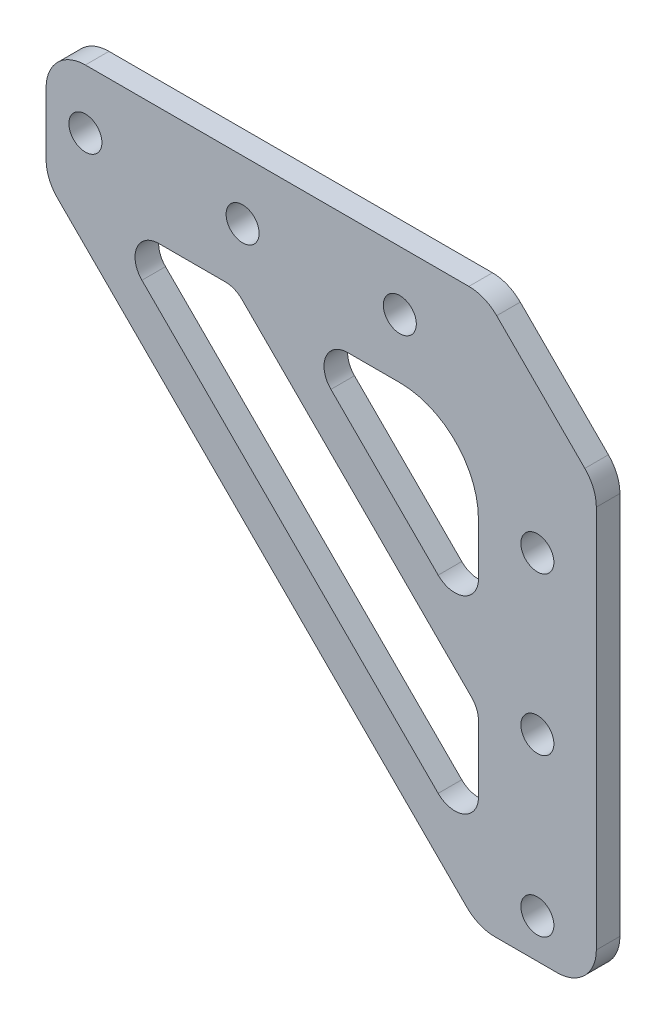
ISO-10303-21;
HEADER;
FILE_DESCRIPTION(('STEP AP214'),'2;1');
FILE_NAME('part.step','',(''),(''),'','','');
FILE_SCHEMA(('AUTOMOTIVE_DESIGN { 1 0 10303 214 1 1 1 1 }'));
ENDSEC;
DATA;
#1=APPLICATION_CONTEXT('core data for automotive mechanical design processes');
#2=APPLICATION_PROTOCOL_DEFINITION('international standard','automotive_design',2000,#1);
#3=PRODUCT_CONTEXT('',#1,'mechanical');
#4=PRODUCT('Part','Part','',(#3));
#5=PRODUCT_RELATED_PRODUCT_CATEGORY('part','',(#4));
#6=PRODUCT_DEFINITION_FORMATION('','',#4);
#7=PRODUCT_DEFINITION_CONTEXT('part definition',#1,'design');
#8=PRODUCT_DEFINITION('design','',#6,#7);
#9=PRODUCT_DEFINITION_SHAPE('','',#8);
#10=(LENGTH_UNIT() NAMED_UNIT(*) SI_UNIT(.MILLI.,.METRE.));
#11=(NAMED_UNIT(*) PLANE_ANGLE_UNIT() SI_UNIT($,.RADIAN.));
#12=(NAMED_UNIT(*) SI_UNIT($,.STERADIAN.) SOLID_ANGLE_UNIT());
#13=UNCERTAINTY_MEASURE_WITH_UNIT(LENGTH_MEASURE(1.E-05),#10,'distance_accuracy_value','');
#14=(GEOMETRIC_REPRESENTATION_CONTEXT(3) GLOBAL_UNCERTAINTY_ASSIGNED_CONTEXT((#13)) GLOBAL_UNIT_ASSIGNED_CONTEXT((#10,
#11,#12)) REPRESENTATION_CONTEXT('',''));
#15=CARTESIAN_POINT('',(0.,0.,0.));
#16=DIRECTION('',(0.,0.,1.));
#17=DIRECTION('',(1.,0.,0.));
#18=AXIS2_PLACEMENT_3D('',#15,#16,#17);
#19=CARTESIAN_POINT('',(-70.,-15.,3.));
#20=DIRECTION('',(0.,1.,0.));
#21=DIRECTION('',(0.,0.,1.));
#22=AXIS2_PLACEMENT_3D('',#19,#20,#21);
#23=PLANE('',#22);
#24=DIRECTION('',(1.,0.,0.));
#25=VECTOR('',#24,1.);
#26=CARTESIAN_POINT('',(-70.,-15.,0.));
#27=LINE('',#26,#25);
#28=CARTESIAN_POINT('',(-31.6446609406726,-15.,0.));
#29=VERTEX_POINT('',#28);
#30=CARTESIAN_POINT('',(-25.,-15.,0.));
#31=VERTEX_POINT('',#30);
#32=EDGE_CURVE('E459',#29,#31,#27,.T.);
#33=ORIENTED_EDGE('',*,*,#32,.T.);
#34=DIRECTION('',(0.,0.,-1.));
#35=VECTOR('',#34,1.);
#36=CARTESIAN_POINT('',(-25.,-15.,3.));
#37=LINE('',#36,#35);
#38=CARTESIAN_POINT('',(-25.,-15.,3.));
#39=VERTEX_POINT('',#38);
#40=EDGE_CURVE('E62',#31,#39,#37,.F.);
#41=ORIENTED_EDGE('',*,*,#40,.T.);
#42=DIRECTION('',(1.,0.,0.));
#43=VECTOR('',#42,1.);
#44=CARTESIAN_POINT('',(-70.,-15.,3.));
#45=LINE('',#44,#43);
#46=CARTESIAN_POINT('',(-31.6446609406726,-15.,3.));
#47=VERTEX_POINT('',#46);
#48=EDGE_CURVE('E446',#47,#39,#45,.T.);
#49=ORIENTED_EDGE('',*,*,#48,.F.);
#50=DIRECTION('',(0.,0.,1.));
#51=VECTOR('',#50,1.);
#52=CARTESIAN_POINT('',(-31.6446609406726,-15.,3.));
#53=LINE('',#52,#51);
#54=EDGE_CURVE('E317',#47,#29,#53,.F.);
#55=ORIENTED_EDGE('',*,*,#54,.T.);
#56=EDGE_LOOP('',(#33,#41,#49,#55));
#57=FACE_BOUND('',#56,.T.);
#58=ADVANCED_FACE('F41',(#57),#23,.F.);
#59=CARTESIAN_POINT('',(-15.,-70.,3.));
#60=DIRECTION('',(1.,0.,0.));
#61=DIRECTION('',(0.,1.,0.));
#62=AXIS2_PLACEMENT_3D('',#59,#60,#61);
#63=PLANE('',#62);
#64=DIRECTION('',(0.,-1.,0.));
#65=VECTOR('',#64,1.);
#66=CARTESIAN_POINT('',(-15.,-70.,3.));
#67=LINE('',#66,#65);
#68=CARTESIAN_POINT('',(-15.,-25.,3.));
#69=VERTEX_POINT('',#68);
#70=CARTESIAN_POINT('',(-15.,-31.6446609406726,3.));
#71=VERTEX_POINT('',#70);
#72=EDGE_CURVE('E356',#69,#71,#67,.T.);
#73=ORIENTED_EDGE('',*,*,#72,.F.);
#74=DIRECTION('',(0.,0.,-1.));
#75=VECTOR('',#74,1.);
#76=CARTESIAN_POINT('',(-15.,-25.,0.));
#77=LINE('',#76,#75);
#78=CARTESIAN_POINT('',(-15.,-25.,0.));
#79=VERTEX_POINT('',#78);
#80=EDGE_CURVE('E349',#69,#79,#77,.T.);
#81=ORIENTED_EDGE('',*,*,#80,.T.);
#82=DIRECTION('',(0.,-1.,0.));
#83=VECTOR('',#82,1.);
#84=CARTESIAN_POINT('',(-15.,-70.,0.));
#85=LINE('',#84,#83);
#86=CARTESIAN_POINT('',(-15.,-31.6446609406726,0.));
#87=VERTEX_POINT('',#86);
#88=EDGE_CURVE('E241',#79,#87,#85,.T.);
#89=ORIENTED_EDGE('',*,*,#88,.T.);
#90=DIRECTION('',(0.,0.,1.));
#91=VECTOR('',#90,1.);
#92=CARTESIAN_POINT('',(-15.,-31.6446609406726,3.));
#93=LINE('',#92,#91);
#94=EDGE_CURVE('E309',#87,#71,#93,.T.);
#95=ORIENTED_EDGE('',*,*,#94,.T.);
#96=EDGE_LOOP('',(#73,#81,#89,#95));
#97=FACE_BOUND('',#96,.T.);
#98=ADVANCED_FACE('F355',(#97),#63,.F.);
#99=CARTESIAN_POINT('',(0.,0.,3.));
#100=DIRECTION('',(-1.,0.,0.));
#101=DIRECTION('',(0.,-1.,0.));
#102=AXIS2_PLACEMENT_3D('',#99,#100,#101);
#103=PLANE('',#102);
#104=DIRECTION('',(0.,1.,0.));
#105=VECTOR('',#104,1.);
#106=CARTESIAN_POINT('',(0.,0.,3.));
#107=LINE('',#106,#105);
#108=CARTESIAN_POINT('',(0.,-65.,3.));
#109=VERTEX_POINT('',#108);
#110=CARTESIAN_POINT('',(0.,-16.2132034355964,3.));
#111=VERTEX_POINT('',#110);
#112=EDGE_CURVE('E240',#109,#111,#107,.T.);
#113=ORIENTED_EDGE('',*,*,#112,.F.);
#114=DIRECTION('',(0.,0.,-1.));
#115=VECTOR('',#114,1.);
#116=CARTESIAN_POINT('',(0.,-65.,3.));
#117=LINE('',#116,#115);
#118=CARTESIAN_POINT('',(0.,-65.,0.));
#119=VERTEX_POINT('',#118);
#120=EDGE_CURVE('E276',#109,#119,#117,.T.);
#121=ORIENTED_EDGE('',*,*,#120,.T.);
#122=DIRECTION('',(0.,1.,0.));
#123=VECTOR('',#122,1.);
#124=CARTESIAN_POINT('',(0.,0.,0.));
#125=LINE('',#124,#123);
#126=CARTESIAN_POINT('',(0.,-16.2132034355964,0.));
#127=VERTEX_POINT('',#126);
#128=EDGE_CURVE('E438',#119,#127,#125,.T.);
#129=ORIENTED_EDGE('',*,*,#128,.T.);
#130=DIRECTION('',(0.,0.,-1.));
#131=VECTOR('',#130,1.);
#132=CARTESIAN_POINT('',(0.,-16.2132034355964,3.));
#133=LINE('',#132,#131);
#134=EDGE_CURVE('E274',#127,#111,#133,.F.);
#135=ORIENTED_EDGE('',*,*,#134,.T.);
#136=EDGE_LOOP('',(#113,#121,#129,#135));
#137=FACE_BOUND('',#136,.T.);
#138=ADVANCED_FACE('F514',(#137),#103,.F.);
#139=CARTESIAN_POINT('',(0.,0.,3.));
#140=DIRECTION('',(0.,0.,-1.));
#141=DIRECTION('',(-1.,0.,0.));
#142=AXIS2_PLACEMENT_3D('',#139,#140,#141);
#143=PLANE('',#142);
#144=DIRECTION('',(-0.707106781186548,0.707106781186547,0.));
#145=VECTOR('',#144,1.);
#146=CARTESIAN_POINT('',(-15.,-62.9289321881345,3.));
#147=LINE('',#146,#145);
#148=CARTESIAN_POINT('',(-20.1213203435596,-57.8076118445749,3.));
#149=VERTEX_POINT('',#148);
#150=CARTESIAN_POINT('',(-57.8076118445749,-20.1213203435596,3.));
#151=VERTEX_POINT('',#150);
#152=EDGE_CURVE('E397',#149,#151,#147,.T.);
#153=ORIENTED_EDGE('',*,*,#152,.T.);
#154=CARTESIAN_POINT('',(-55.6862915010152,-18.,3.));
#155=DIRECTION('',(0.,0.,-1.));
#156=DIRECTION('',(-1.,0.,0.));
#157=AXIS2_PLACEMENT_3D('',#154,#155,#156);
#158=CIRCLE('',#157,3.);
#159=CARTESIAN_POINT('',(-55.6862915010152,-15.,3.));
#160=VERTEX_POINT('',#159);
#161=EDGE_CURVE('E345',#151,#160,#158,.T.);
#162=ORIENTED_EDGE('',*,*,#161,.T.);
#163=CARTESIAN_POINT('',(-47.2010101267766,-15.,3.));
#164=VERTEX_POINT('',#163);
#165=EDGE_CURVE('E448',#160,#164,#45,.T.);
#166=ORIENTED_EDGE('',*,*,#165,.T.);
#167=CARTESIAN_POINT('',(-47.2010101267766,-18.,3.));
#168=DIRECTION('',(0.,0.,-1.));
#169=DIRECTION('',(-1.,0.,0.));
#170=AXIS2_PLACEMENT_3D('',#167,#168,#169);
#171=CIRCLE('',#170,3.);
#172=CARTESIAN_POINT('',(-45.079689783217,-15.8786796564404,3.));
#173=VERTEX_POINT('',#172);
#174=EDGE_CURVE('E328',#164,#173,#171,.T.);
#175=ORIENTED_EDGE('',*,*,#174,.T.);
#176=DIRECTION('',(0.707106781186547,-0.707106781186547,0.));
#177=VECTOR('',#176,1.);
#178=CARTESIAN_POINT('',(-45.9583694396574,-15.,3.));
#179=LINE('',#178,#177);
#180=CARTESIAN_POINT('',(-15.8786796564404,-45.079689783217,3.));
#181=VERTEX_POINT('',#180);
#182=EDGE_CURVE('E379',#173,#181,#179,.T.);
#183=ORIENTED_EDGE('',*,*,#182,.T.);
#184=CARTESIAN_POINT('',(-18.,-47.2010101267767,3.));
#185=DIRECTION('',(0.,0.,-1.));
#186=DIRECTION('',(-1.,0.,0.));
#187=AXIS2_PLACEMENT_3D('',#184,#185,#186);
#188=CIRCLE('',#187,3.);
#189=CARTESIAN_POINT('',(-15.,-47.2010101267767,3.));
#190=VERTEX_POINT('',#189);
#191=EDGE_CURVE('E324',#181,#190,#188,.T.);
#192=ORIENTED_EDGE('',*,*,#191,.T.);
#193=CARTESIAN_POINT('',(-15.,-55.6862915010152,3.));
#194=VERTEX_POINT('',#193);
#195=EDGE_CURVE('E450',#190,#194,#67,.T.);
#196=ORIENTED_EDGE('',*,*,#195,.T.);
#197=CARTESIAN_POINT('',(-18.,-55.6862915010152,3.));
#198=DIRECTION('',(0.,0.,-1.));
#199=DIRECTION('',(-1.,0.,0.));
#200=AXIS2_PLACEMENT_3D('',#197,#198,#199);
#201=CIRCLE('',#200,3.);
#202=EDGE_CURVE('E341',#194,#149,#201,.T.);
#203=ORIENTED_EDGE('',*,*,#202,.T.);
#204=EDGE_LOOP('',(#153,#162,#166,#175,#183,#192,#196,#203));
#205=FACE_BOUND('',#204,.T.);
#206=ORIENTED_EDGE('',*,*,#48,.T.);
#207=CARTESIAN_POINT('',(-25.,-25.,3.));
#208=DIRECTION('',(0.,0.,-1.));
#209=DIRECTION('',(-1.,0.,0.));
#210=AXIS2_PLACEMENT_3D('',#207,#208,#209);
#211=CIRCLE('',#210,10.);
#212=EDGE_CURVE('E11',#39,#69,#211,.T.);
#213=ORIENTED_EDGE('',*,*,#212,.T.);
#214=ORIENTED_EDGE('',*,*,#72,.T.);
#215=CARTESIAN_POINT('',(-18.,-31.6446609406726,3.));
#216=DIRECTION('',(0.,0.,-1.));
#217=DIRECTION('',(-1.,0.,0.));
#218=AXIS2_PLACEMENT_3D('',#215,#216,#217);
#219=CIRCLE('',#218,3.);
#220=CARTESIAN_POINT('',(-20.1213203435596,-33.7659812842323,3.));
#221=VERTEX_POINT('',#220);
#222=EDGE_CURVE('E332',#71,#221,#219,.T.);
#223=ORIENTED_EDGE('',*,*,#222,.T.);
#224=DIRECTION('',(-0.707106781186548,0.707106781186547,0.));
#225=VECTOR('',#224,1.);
#226=CARTESIAN_POINT('',(-15.,-38.8873016277919,3.));
#227=LINE('',#226,#225);
#228=CARTESIAN_POINT('',(-33.7659812842323,-20.1213203435596,3.));
#229=VERTEX_POINT('',#228);
#230=EDGE_CURVE('E374',#221,#229,#227,.T.);
#231=ORIENTED_EDGE('',*,*,#230,.T.);
#232=CARTESIAN_POINT('',(-31.6446609406726,-18.,3.));
#233=DIRECTION('',(0.,0.,-1.));
#234=DIRECTION('',(-1.,0.,0.));
#235=AXIS2_PLACEMENT_3D('',#232,#233,#234);
#236=CIRCLE('',#235,3.);
#237=EDGE_CURVE('E337',#229,#47,#236,.T.);
#238=ORIENTED_EDGE('',*,*,#237,.T.);
#239=EDGE_LOOP('',(#206,#213,#214,#223,#231,#238));
#240=FACE_BOUND('',#239,.T.);
#241=DIRECTION('',(0.707106781186548,-0.707106781186548,0.));
#242=VECTOR('',#241,1.);
#243=CARTESIAN_POINT('',(-70.,-15.,3.));
#244=LINE('',#243,#242);
#245=CARTESIAN_POINT('',(-68.5355339059327,-16.4644660940673,3.));
#246=VERTEX_POINT('',#245);
#247=CARTESIAN_POINT('',(-16.4644660940673,-68.5355339059327,3.));
#248=VERTEX_POINT('',#247);
#249=EDGE_CURVE('E390',#246,#248,#244,.T.);
#250=ORIENTED_EDGE('',*,*,#249,.T.);
#251=CARTESIAN_POINT('',(-12.9289321881345,-65.,3.));
#252=DIRECTION('',(0.,0.,-1.));
#253=DIRECTION('',(-1.,0.,0.));
#254=AXIS2_PLACEMENT_3D('',#251,#252,#253);
#255=CIRCLE('',#254,5.);
#256=CARTESIAN_POINT('',(-12.9289321881345,-70.,3.));
#257=VERTEX_POINT('',#256);
#258=EDGE_CURVE('E272',#248,#257,#255,.F.);
#259=ORIENTED_EDGE('',*,*,#258,.T.);
#260=DIRECTION('',(1.,0.,0.));
#261=VECTOR('',#260,1.);
#262=CARTESIAN_POINT('',(0.,-70.,3.));
#263=LINE('',#262,#261);
#264=CARTESIAN_POINT('',(-4.99999999999996,-70.,3.));
#265=VERTEX_POINT('',#264);
#266=EDGE_CURVE('E234',#257,#265,#263,.T.);
#267=ORIENTED_EDGE('',*,*,#266,.T.);
#268=CARTESIAN_POINT('',(-4.99999999999996,-65.,3.));
#269=DIRECTION('',(0.,0.,-1.));
#270=DIRECTION('',(-1.,0.,0.));
#271=AXIS2_PLACEMENT_3D('',#268,#269,#270);
#272=CIRCLE('',#271,5.);
#273=EDGE_CURVE('E270',#265,#109,#272,.F.);
#274=ORIENTED_EDGE('',*,*,#273,.T.);
#275=ORIENTED_EDGE('',*,*,#112,.T.);
#276=CARTESIAN_POINT('',(-4.99999999999999,-16.2132034355964,3.));
#277=DIRECTION('',(0.,0.,-1.));
#278=DIRECTION('',(-1.,0.,0.));
#279=AXIS2_PLACEMENT_3D('',#276,#277,#278);
#280=CIRCLE('',#279,5.);
#281=CARTESIAN_POINT('',(-1.46446609406726,-12.6776695296637,3.));
#282=VERTEX_POINT('',#281);
#283=EDGE_CURVE('E264',#111,#282,#280,.F.);
#284=ORIENTED_EDGE('',*,*,#283,.T.);
#285=DIRECTION('',(-0.707106781186548,0.707106781186547,0.));
#286=VECTOR('',#285,1.);
#287=CARTESIAN_POINT('',(-14.142135623731,0.,3.));
#288=LINE('',#287,#286);
#289=CARTESIAN_POINT('',(-12.6776695296637,-1.46446609406725,3.));
#290=VERTEX_POINT('',#289);
#291=EDGE_CURVE('E391',#282,#290,#288,.T.);
#292=ORIENTED_EDGE('',*,*,#291,.T.);
#293=CARTESIAN_POINT('',(-16.2132034355964,-4.99999999999999,3.));
#294=DIRECTION('',(0.,0.,-1.));
#295=DIRECTION('',(-1.,0.,0.));
#296=AXIS2_PLACEMENT_3D('',#293,#294,#295);
#297=CIRCLE('',#296,5.);
#298=CARTESIAN_POINT('',(-16.2132034355964,0.,3.));
#299=VERTEX_POINT('',#298);
#300=EDGE_CURVE('E262',#290,#299,#297,.F.);
#301=ORIENTED_EDGE('',*,*,#300,.T.);
#302=DIRECTION('',(-1.,0.,0.));
#303=VECTOR('',#302,1.);
#304=CARTESIAN_POINT('',(0.,0.,3.));
#305=LINE('',#304,#303);
#306=CARTESIAN_POINT('',(-65.,0.,3.));
#307=VERTEX_POINT('',#306);
#308=EDGE_CURVE('E244',#299,#307,#305,.T.);
#309=ORIENTED_EDGE('',*,*,#308,.T.);
#310=CARTESIAN_POINT('',(-65.,-4.99999999999997,3.));
#311=DIRECTION('',(0.,0.,-1.));
#312=DIRECTION('',(-1.,0.,0.));
#313=AXIS2_PLACEMENT_3D('',#310,#311,#312);
#314=CIRCLE('',#313,5.);
#315=CARTESIAN_POINT('',(-70.,-4.99999999999996,3.));
#316=VERTEX_POINT('',#315);
#317=EDGE_CURVE('E266',#307,#316,#314,.F.);
#318=ORIENTED_EDGE('',*,*,#317,.T.);
#319=DIRECTION('',(0.,-1.,0.));
#320=VECTOR('',#319,1.);
#321=CARTESIAN_POINT('',(-70.,0.,3.));
#322=LINE('',#321,#320);
#323=CARTESIAN_POINT('',(-70.,-12.9289321881345,3.));
#324=VERTEX_POINT('',#323);
#325=EDGE_CURVE('E443',#316,#324,#322,.T.);
#326=ORIENTED_EDGE('',*,*,#325,.T.);
#327=CARTESIAN_POINT('',(-65.,-12.9289321881345,3.));
#328=DIRECTION('',(0.,0.,-1.));
#329=DIRECTION('',(-1.,0.,0.));
#330=AXIS2_PLACEMENT_3D('',#327,#328,#329);
#331=CIRCLE('',#330,5.);
#332=EDGE_CURVE('E268',#324,#246,#331,.F.);
#333=ORIENTED_EDGE('',*,*,#332,.T.);
#334=EDGE_LOOP('',(#250,#259,#267,#274,#275,#284,#292,#301,#309,#318,#326,#333));
#335=FACE_BOUND('',#334,.T.);
#336=CARTESIAN_POINT('',(-45.,-7.5,3.));
#337=DIRECTION('',(0.,0.,1.));
#338=DIRECTION('',(1.,0.,0.));
#339=AXIS2_PLACEMENT_3D('',#336,#337,#338);
#340=CIRCLE('',#339,2.1);
#341=CARTESIAN_POINT('',(-42.9,-7.5,3.));
#342=VERTEX_POINT('',#341);
#343=EDGE_CURVE('E435',#342,#342,#340,.T.);
#344=ORIENTED_EDGE('',*,*,#343,.F.);
#345=EDGE_LOOP('',(#344));
#346=FACE_BOUND('',#345,.T.);
#347=CARTESIAN_POINT('',(-25.,-7.5,3.));
#348=DIRECTION('',(0.,0.,1.));
#349=DIRECTION('',(1.,0.,0.));
#350=AXIS2_PLACEMENT_3D('',#347,#348,#349);
#351=CIRCLE('',#350,2.1);
#352=CARTESIAN_POINT('',(-22.9,-7.5,3.));
#353=VERTEX_POINT('',#352);
#354=EDGE_CURVE('E429',#353,#353,#351,.T.);
#355=ORIENTED_EDGE('',*,*,#354,.F.);
#356=EDGE_LOOP('',(#355));
#357=FACE_BOUND('',#356,.T.);
#358=CARTESIAN_POINT('',(-7.49999999999999,-25.,3.));
#359=DIRECTION('',(0.,0.,1.));
#360=DIRECTION('',(-1.,0.,0.));
#361=AXIS2_PLACEMENT_3D('',#358,#359,#360);
#362=CIRCLE('',#361,2.1);
#363=CARTESIAN_POINT('',(-9.59999999999999,-25.,3.));
#364=VERTEX_POINT('',#363);
#365=EDGE_CURVE('E423',#364,#364,#362,.T.);
#366=ORIENTED_EDGE('',*,*,#365,.F.);
#367=EDGE_LOOP('',(#366));
#368=FACE_BOUND('',#367,.T.);
#369=CARTESIAN_POINT('',(-7.49999999999999,-65.,3.));
#370=DIRECTION('',(0.,0.,1.));
#371=DIRECTION('',(-1.,0.,0.));
#372=AXIS2_PLACEMENT_3D('',#369,#370,#371);
#373=CIRCLE('',#372,2.10000000000002);
#374=CARTESIAN_POINT('',(-9.60000000000001,-65.,3.));
#375=VERTEX_POINT('',#374);
#376=EDGE_CURVE('E417',#375,#375,#373,.T.);
#377=ORIENTED_EDGE('',*,*,#376,.F.);
#378=EDGE_LOOP('',(#377));
#379=FACE_BOUND('',#378,.T.);
#380=CARTESIAN_POINT('',(-65.,-7.5,3.));
#381=DIRECTION('',(0.,0.,1.));
#382=DIRECTION('',(1.,0.,0.));
#383=AXIS2_PLACEMENT_3D('',#380,#381,#382);
#384=CIRCLE('',#383,2.1);
#385=CARTESIAN_POINT('',(-62.9,-7.5,3.));
#386=VERTEX_POINT('',#385);
#387=EDGE_CURVE('E411',#386,#386,#384,.T.);
#388=ORIENTED_EDGE('',*,*,#387,.F.);
#389=EDGE_LOOP('',(#388));
#390=FACE_BOUND('',#389,.T.);
#391=CARTESIAN_POINT('',(-7.49999999999999,-45.,3.));
#392=DIRECTION('',(0.,0.,1.));
#393=DIRECTION('',(-1.,0.,0.));
#394=AXIS2_PLACEMENT_3D('',#391,#392,#393);
#395=CIRCLE('',#394,2.10000000000001);
#396=CARTESIAN_POINT('',(-9.6,-45.,3.));
#397=VERTEX_POINT('',#396);
#398=EDGE_CURVE('E405',#397,#397,#395,.T.);
#399=ORIENTED_EDGE('',*,*,#398,.F.);
#400=EDGE_LOOP('',(#399));
#401=FACE_BOUND('',#400,.T.);
#402=ADVANCED_FACE('F372',(#205,#240,#335,#346,#357,#368,#379,#390,#401),#143,.F.);
#403=CARTESIAN_POINT('',(0.,0.,0.));
#404=DIRECTION('',(0.,0.,-1.));
#405=DIRECTION('',(-1.,0.,0.));
#406=AXIS2_PLACEMENT_3D('',#403,#404,#405);
#407=PLANE('',#406);
#408=DIRECTION('',(0.707106781186547,-0.707106781186547,0.));
#409=VECTOR('',#408,1.);
#410=CARTESIAN_POINT('',(-45.9583694396574,-15.,0.));
#411=LINE('',#410,#409);
#412=CARTESIAN_POINT('',(-45.079689783217,-15.8786796564404,0.));
#413=VERTEX_POINT('',#412);
#414=CARTESIAN_POINT('',(-15.8786796564404,-45.079689783217,0.));
#415=VERTEX_POINT('',#414);
#416=EDGE_CURVE('E378',#413,#415,#411,.T.);
#417=ORIENTED_EDGE('',*,*,#416,.F.);
#418=CARTESIAN_POINT('',(-47.2010101267766,-18.,0.));
#419=DIRECTION('',(0.,0.,-1.));
#420=DIRECTION('',(-1.,0.,0.));
#421=AXIS2_PLACEMENT_3D('',#418,#419,#420);
#422=CIRCLE('',#421,3.);
#423=CARTESIAN_POINT('',(-47.2010101267766,-15.,0.));
#424=VERTEX_POINT('',#423);
#425=EDGE_CURVE('E330',#413,#424,#422,.F.);
#426=ORIENTED_EDGE('',*,*,#425,.T.);
#427=CARTESIAN_POINT('',(-55.6862915010152,-15.,0.));
#428=VERTEX_POINT('',#427);
#429=EDGE_CURVE('E460',#428,#424,#27,.T.);
#430=ORIENTED_EDGE('',*,*,#429,.F.);
#431=CARTESIAN_POINT('',(-55.6862915010152,-18.,0.));
#432=DIRECTION('',(0.,0.,-1.));
#433=DIRECTION('',(-1.,0.,0.));
#434=AXIS2_PLACEMENT_3D('',#431,#432,#433);
#435=CIRCLE('',#434,3.);
#436=CARTESIAN_POINT('',(-57.8076118445749,-20.1213203435596,0.));
#437=VERTEX_POINT('',#436);
#438=EDGE_CURVE('E347',#428,#437,#435,.F.);
#439=ORIENTED_EDGE('',*,*,#438,.T.);
#440=DIRECTION('',(-0.707106781186548,0.707106781186547,0.));
#441=VECTOR('',#440,1.);
#442=CARTESIAN_POINT('',(-15.,-62.9289321881345,0.));
#443=LINE('',#442,#441);
#444=CARTESIAN_POINT('',(-20.1213203435596,-57.8076118445749,0.));
#445=VERTEX_POINT('',#444);
#446=EDGE_CURVE('E396',#445,#437,#443,.T.);
#447=ORIENTED_EDGE('',*,*,#446,.F.);
#448=CARTESIAN_POINT('',(-18.,-55.6862915010152,0.));
#449=DIRECTION('',(0.,0.,-1.));
#450=DIRECTION('',(-1.,0.,0.));
#451=AXIS2_PLACEMENT_3D('',#448,#449,#450);
#452=CIRCLE('',#451,3.);
#453=CARTESIAN_POINT('',(-15.,-55.6862915010152,0.));
#454=VERTEX_POINT('',#453);
#455=EDGE_CURVE('E343',#445,#454,#452,.F.);
#456=ORIENTED_EDGE('',*,*,#455,.T.);
#457=CARTESIAN_POINT('',(-15.,-47.2010101267767,0.));
#458=VERTEX_POINT('',#457);
#459=EDGE_CURVE('E246',#458,#454,#85,.T.);
#460=ORIENTED_EDGE('',*,*,#459,.F.);
#461=CARTESIAN_POINT('',(-18.,-47.2010101267767,0.));
#462=DIRECTION('',(0.,0.,-1.));
#463=DIRECTION('',(-1.,0.,0.));
#464=AXIS2_PLACEMENT_3D('',#461,#462,#463);
#465=CIRCLE('',#464,3.);
#466=EDGE_CURVE('E326',#458,#415,#465,.F.);
#467=ORIENTED_EDGE('',*,*,#466,.T.);
#468=EDGE_LOOP('',(#417,#426,#430,#439,#447,#456,#460,#467));
#469=FACE_BOUND('',#468,.T.);
#470=DIRECTION('',(1.,0.,0.));
#471=VECTOR('',#470,1.);
#472=CARTESIAN_POINT('',(0.,-70.,0.));
#473=LINE('',#472,#471);
#474=CARTESIAN_POINT('',(-12.9289321881345,-70.,0.));
#475=VERTEX_POINT('',#474);
#476=CARTESIAN_POINT('',(-4.99999999999996,-70.,0.));
#477=VERTEX_POINT('',#476);
#478=EDGE_CURVE('E231',#475,#477,#473,.T.);
#479=ORIENTED_EDGE('',*,*,#478,.F.);
#480=CARTESIAN_POINT('',(-12.9289321881345,-65.,0.));
#481=DIRECTION('',(0.,0.,-1.));
#482=DIRECTION('',(-1.,0.,0.));
#483=AXIS2_PLACEMENT_3D('',#480,#481,#482);
#484=CIRCLE('',#483,5.);
#485=CARTESIAN_POINT('',(-16.4644660940673,-68.5355339059327,0.));
#486=VERTEX_POINT('',#485);
#487=EDGE_CURVE('E214',#475,#486,#484,.T.);
#488=ORIENTED_EDGE('',*,*,#487,.T.);
#489=DIRECTION('',(0.707106781186548,-0.707106781186548,0.));
#490=VECTOR('',#489,1.);
#491=CARTESIAN_POINT('',(-70.,-15.,0.));
#492=LINE('',#491,#490);
#493=CARTESIAN_POINT('',(-68.5355339059327,-16.4644660940673,0.));
#494=VERTEX_POINT('',#493);
#495=EDGE_CURVE('E394',#494,#486,#492,.T.);
#496=ORIENTED_EDGE('',*,*,#495,.F.);
#497=CARTESIAN_POINT('',(-65.,-12.9289321881345,0.));
#498=DIRECTION('',(0.,0.,-1.));
#499=DIRECTION('',(-1.,0.,0.));
#500=AXIS2_PLACEMENT_3D('',#497,#498,#499);
#501=CIRCLE('',#500,5.);
#502=CARTESIAN_POINT('',(-70.,-12.9289321881345,0.));
#503=VERTEX_POINT('',#502);
#504=EDGE_CURVE('E256',#494,#503,#501,.T.);
#505=ORIENTED_EDGE('',*,*,#504,.T.);
#506=DIRECTION('',(0.,-1.,0.));
#507=VECTOR('',#506,1.);
#508=CARTESIAN_POINT('',(-70.,0.,0.));
#509=LINE('',#508,#507);
#510=CARTESIAN_POINT('',(-70.,-4.99999999999996,0.));
#511=VERTEX_POINT('',#510);
#512=EDGE_CURVE('E457',#511,#503,#509,.T.);
#513=ORIENTED_EDGE('',*,*,#512,.F.);
#514=CARTESIAN_POINT('',(-65.,-4.99999999999997,0.));
#515=DIRECTION('',(0.,0.,-1.));
#516=DIRECTION('',(-1.,0.,0.));
#517=AXIS2_PLACEMENT_3D('',#514,#515,#516);
#518=CIRCLE('',#517,5.);
#519=CARTESIAN_POINT('',(-65.,0.,0.));
#520=VERTEX_POINT('',#519);
#521=EDGE_CURVE('E254',#511,#520,#518,.T.);
#522=ORIENTED_EDGE('',*,*,#521,.T.);
#523=DIRECTION('',(-1.,0.,0.));
#524=VECTOR('',#523,1.);
#525=CARTESIAN_POINT('',(0.,0.,0.));
#526=LINE('',#525,#524);
#527=CARTESIAN_POINT('',(-16.2132034355964,0.,0.));
#528=VERTEX_POINT('',#527);
#529=EDGE_CURVE('E454',#528,#520,#526,.T.);
#530=ORIENTED_EDGE('',*,*,#529,.F.);
#531=CARTESIAN_POINT('',(-16.2132034355964,-4.99999999999999,0.));
#532=DIRECTION('',(0.,0.,-1.));
#533=DIRECTION('',(-1.,0.,0.));
#534=AXIS2_PLACEMENT_3D('',#531,#532,#533);
#535=CIRCLE('',#534,5.);
#536=CARTESIAN_POINT('',(-12.6776695296637,-1.46446609406725,0.));
#537=VERTEX_POINT('',#536);
#538=EDGE_CURVE('E235',#528,#537,#535,.T.);
#539=ORIENTED_EDGE('',*,*,#538,.T.);
#540=DIRECTION('',(-0.707106781186548,0.707106781186547,0.));
#541=VECTOR('',#540,1.);
#542=CARTESIAN_POINT('',(-14.142135623731,0.,0.));
#543=LINE('',#542,#541);
#544=CARTESIAN_POINT('',(-1.46446609406726,-12.6776695296637,0.));
#545=VERTEX_POINT('',#544);
#546=EDGE_CURVE('E387',#545,#537,#543,.T.);
#547=ORIENTED_EDGE('',*,*,#546,.F.);
#548=CARTESIAN_POINT('',(-4.99999999999999,-16.2132034355964,0.));
#549=DIRECTION('',(0.,0.,-1.));
#550=DIRECTION('',(-1.,0.,0.));
#551=AXIS2_PLACEMENT_3D('',#548,#549,#550);
#552=CIRCLE('',#551,5.);
#553=EDGE_CURVE('E252',#545,#127,#552,.T.);
#554=ORIENTED_EDGE('',*,*,#553,.T.);
#555=ORIENTED_EDGE('',*,*,#128,.F.);
#556=CARTESIAN_POINT('',(-4.99999999999996,-65.,0.));
#557=DIRECTION('',(0.,0.,-1.));
#558=DIRECTION('',(-1.,0.,0.));
#559=AXIS2_PLACEMENT_3D('',#556,#557,#558);
#560=CIRCLE('',#559,5.);
#561=EDGE_CURVE('E225',#119,#477,#560,.T.);
#562=ORIENTED_EDGE('',*,*,#561,.T.);
#563=EDGE_LOOP('',(#479,#488,#496,#505,#513,#522,#530,#539,#547,#554,#555,#562));
#564=FACE_BOUND('',#563,.T.);
#565=ORIENTED_EDGE('',*,*,#32,.F.);
#566=CARTESIAN_POINT('',(-31.6446609406726,-18.,0.));
#567=DIRECTION('',(0.,0.,-1.));
#568=DIRECTION('',(-1.,0.,0.));
#569=AXIS2_PLACEMENT_3D('',#566,#567,#568);
#570=CIRCLE('',#569,3.);
#571=CARTESIAN_POINT('',(-33.7659812842323,-20.1213203435596,0.));
#572=VERTEX_POINT('',#571);
#573=EDGE_CURVE('E339',#29,#572,#570,.F.);
#574=ORIENTED_EDGE('',*,*,#573,.T.);
#575=DIRECTION('',(-0.707106781186548,0.707106781186547,0.));
#576=VECTOR('',#575,1.);
#577=CARTESIAN_POINT('',(-15.,-38.8873016277919,0.));
#578=LINE('',#577,#576);
#579=CARTESIAN_POINT('',(-20.1213203435596,-33.7659812842323,0.));
#580=VERTEX_POINT('',#579);
#581=EDGE_CURVE('E364',#580,#572,#578,.T.);
#582=ORIENTED_EDGE('',*,*,#581,.F.);
#583=CARTESIAN_POINT('',(-18.,-31.6446609406726,0.));
#584=DIRECTION('',(0.,0.,-1.));
#585=DIRECTION('',(-1.,0.,0.));
#586=AXIS2_PLACEMENT_3D('',#583,#584,#585);
#587=CIRCLE('',#586,3.);
#588=EDGE_CURVE('E334',#580,#87,#587,.F.);
#589=ORIENTED_EDGE('',*,*,#588,.T.);
#590=ORIENTED_EDGE('',*,*,#88,.F.);
#591=CARTESIAN_POINT('',(-25.,-25.,0.));
#592=DIRECTION('',(0.,0.,-1.));
#593=DIRECTION('',(-1.,0.,0.));
#594=AXIS2_PLACEMENT_3D('',#591,#592,#593);
#595=CIRCLE('',#594,10.);
#596=EDGE_CURVE('E49',#79,#31,#595,.F.);
#597=ORIENTED_EDGE('',*,*,#596,.T.);
#598=EDGE_LOOP('',(#565,#574,#582,#589,#590,#597));
#599=FACE_BOUND('',#598,.T.);
#600=CARTESIAN_POINT('',(-65.,-7.5,0.));
#601=DIRECTION('',(0.,0.,1.));
#602=DIRECTION('',(1.,0.,0.));
#603=AXIS2_PLACEMENT_3D('',#600,#601,#602);
#604=CIRCLE('',#603,2.1);
#605=CARTESIAN_POINT('',(-62.9,-7.5,0.));
#606=VERTEX_POINT('',#605);
#607=EDGE_CURVE('E408',#606,#606,#604,.T.);
#608=ORIENTED_EDGE('',*,*,#607,.T.);
#609=EDGE_LOOP('',(#608));
#610=FACE_BOUND('',#609,.T.);
#611=CARTESIAN_POINT('',(-7.49999999999999,-25.,0.));
#612=DIRECTION('',(0.,0.,1.));
#613=DIRECTION('',(-1.,0.,0.));
#614=AXIS2_PLACEMENT_3D('',#611,#612,#613);
#615=CIRCLE('',#614,2.1);
#616=CARTESIAN_POINT('',(-9.59999999999999,-25.,0.));
#617=VERTEX_POINT('',#616);
#618=EDGE_CURVE('E420',#617,#617,#615,.T.);
#619=ORIENTED_EDGE('',*,*,#618,.T.);
#620=EDGE_LOOP('',(#619));
#621=FACE_BOUND('',#620,.T.);
#622=CARTESIAN_POINT('',(-45.,-7.5,0.));
#623=DIRECTION('',(0.,0.,1.));
#624=DIRECTION('',(1.,0.,0.));
#625=AXIS2_PLACEMENT_3D('',#622,#623,#624);
#626=CIRCLE('',#625,2.1);
#627=CARTESIAN_POINT('',(-42.9,-7.5,0.));
#628=VERTEX_POINT('',#627);
#629=EDGE_CURVE('E432',#628,#628,#626,.T.);
#630=ORIENTED_EDGE('',*,*,#629,.T.);
#631=EDGE_LOOP('',(#630));
#632=FACE_BOUND('',#631,.T.);
#633=CARTESIAN_POINT('',(-25.,-7.5,0.));
#634=DIRECTION('',(0.,0.,1.));
#635=DIRECTION('',(1.,0.,0.));
#636=AXIS2_PLACEMENT_3D('',#633,#634,#635);
#637=CIRCLE('',#636,2.1);
#638=CARTESIAN_POINT('',(-22.9,-7.5,0.));
#639=VERTEX_POINT('',#638);
#640=EDGE_CURVE('E426',#639,#639,#637,.T.);
#641=ORIENTED_EDGE('',*,*,#640,.T.);
#642=EDGE_LOOP('',(#641));
#643=FACE_BOUND('',#642,.T.);
#644=CARTESIAN_POINT('',(-7.49999999999999,-65.,0.));
#645=DIRECTION('',(0.,0.,1.));
#646=DIRECTION('',(-1.,0.,0.));
#647=AXIS2_PLACEMENT_3D('',#644,#645,#646);
#648=CIRCLE('',#647,2.10000000000002);
#649=CARTESIAN_POINT('',(-9.60000000000001,-65.,0.));
#650=VERTEX_POINT('',#649);
#651=EDGE_CURVE('E414',#650,#650,#648,.T.);
#652=ORIENTED_EDGE('',*,*,#651,.T.);
#653=EDGE_LOOP('',(#652));
#654=FACE_BOUND('',#653,.T.);
#655=CARTESIAN_POINT('',(-7.49999999999999,-45.,0.));
#656=DIRECTION('',(0.,0.,1.));
#657=DIRECTION('',(-1.,0.,0.));
#658=AXIS2_PLACEMENT_3D('',#655,#656,#657);
#659=CIRCLE('',#658,2.10000000000001);
#660=CARTESIAN_POINT('',(-9.6,-45.,0.));
#661=VERTEX_POINT('',#660);
#662=EDGE_CURVE('E400',#661,#661,#659,.T.);
#663=ORIENTED_EDGE('',*,*,#662,.T.);
#664=EDGE_LOOP('',(#663));
#665=FACE_BOUND('',#664,.T.);
#666=ADVANCED_FACE('F238',(#469,#564,#599,#610,#621,#632,#643,#654,#665),#407,.T.);
#667=CARTESIAN_POINT('',(0.,0.,3.));
#668=DIRECTION('',(0.,-1.,0.));
#669=DIRECTION('',(1.,0.,0.));
#670=AXIS2_PLACEMENT_3D('',#667,#668,#669);
#671=PLANE('',#670);
#672=ORIENTED_EDGE('',*,*,#529,.T.);
#673=DIRECTION('',(0.,0.,-1.));
#674=VECTOR('',#673,1.);
#675=CARTESIAN_POINT('',(-65.,0.,3.));
#676=LINE('',#675,#674);
#677=EDGE_CURVE('E287',#520,#307,#676,.F.);
#678=ORIENTED_EDGE('',*,*,#677,.T.);
#679=ORIENTED_EDGE('',*,*,#308,.F.);
#680=DIRECTION('',(0.,0.,-1.));
#681=VECTOR('',#680,1.);
#682=CARTESIAN_POINT('',(-16.2132034355964,0.,0.));
#683=LINE('',#682,#681);
#684=EDGE_CURVE('E284',#299,#528,#683,.T.);
#685=ORIENTED_EDGE('',*,*,#684,.T.);
#686=EDGE_LOOP('',(#672,#678,#679,#685));
#687=FACE_BOUND('',#686,.T.);
#688=ADVANCED_FACE('F504',(#687),#671,.F.);
#689=CARTESIAN_POINT('',(-70.,0.,3.));
#690=DIRECTION('',(1.,0.,0.));
#691=DIRECTION('',(0.,0.,-1.));
#692=AXIS2_PLACEMENT_3D('',#689,#690,#691);
#693=PLANE('',#692);
#694=ORIENTED_EDGE('',*,*,#512,.T.);
#695=DIRECTION('',(0.,0.,-1.));
#696=VECTOR('',#695,1.);
#697=CARTESIAN_POINT('',(-70.,-12.9289321881345,3.));
#698=LINE('',#697,#696);
#699=EDGE_CURVE('E282',#503,#324,#698,.F.);
#700=ORIENTED_EDGE('',*,*,#699,.T.);
#701=ORIENTED_EDGE('',*,*,#325,.F.);
#702=DIRECTION('',(0.,0.,-1.));
#703=VECTOR('',#702,1.);
#704=CARTESIAN_POINT('',(-70.,-4.99999999999997,3.));
#705=LINE('',#704,#703);
#706=EDGE_CURVE('E279',#316,#511,#705,.T.);
#707=ORIENTED_EDGE('',*,*,#706,.T.);
#708=EDGE_LOOP('',(#694,#700,#701,#707));
#709=FACE_BOUND('',#708,.T.);
#710=ADVANCED_FACE('F511',(#709),#693,.F.);
#711=ORIENTED_EDGE('',*,*,#429,.T.);
#712=DIRECTION('',(0.,0.,1.));
#713=VECTOR('',#712,1.);
#714=CARTESIAN_POINT('',(-47.2010101267766,-15.,3.));
#715=LINE('',#714,#713);
#716=EDGE_CURVE('E306',#424,#164,#715,.T.);
#717=ORIENTED_EDGE('',*,*,#716,.T.);
#718=ORIENTED_EDGE('',*,*,#165,.F.);
#719=DIRECTION('',(0.,0.,1.));
#720=VECTOR('',#719,1.);
#721=CARTESIAN_POINT('',(-55.6862915010152,-15.,3.));
#722=LINE('',#721,#720);
#723=EDGE_CURVE('E304',#160,#428,#722,.F.);
#724=ORIENTED_EDGE('',*,*,#723,.T.);
#725=EDGE_LOOP('',(#711,#717,#718,#724));
#726=FACE_BOUND('',#725,.T.);
#727=ADVANCED_FACE('F491',(#726),#23,.F.);
#728=ORIENTED_EDGE('',*,*,#195,.F.);
#729=DIRECTION('',(0.,0.,1.));
#730=VECTOR('',#729,1.);
#731=CARTESIAN_POINT('',(-15.,-47.2010101267767,3.));
#732=LINE('',#731,#730);
#733=EDGE_CURVE('E302',#190,#458,#732,.F.);
#734=ORIENTED_EDGE('',*,*,#733,.T.);
#735=ORIENTED_EDGE('',*,*,#459,.T.);
#736=DIRECTION('',(0.,0.,1.));
#737=VECTOR('',#736,1.);
#738=CARTESIAN_POINT('',(-15.,-55.6862915010152,3.));
#739=LINE('',#738,#737);
#740=EDGE_CURVE('E299',#454,#194,#739,.T.);
#741=ORIENTED_EDGE('',*,*,#740,.T.);
#742=EDGE_LOOP('',(#728,#734,#735,#741));
#743=FACE_BOUND('',#742,.T.);
#744=ADVANCED_FACE('F470',(#743),#63,.F.);
#745=CARTESIAN_POINT('',(0.,-70.,3.));
#746=DIRECTION('',(0.,1.,0.));
#747=DIRECTION('',(-1.,0.,0.));
#748=AXIS2_PLACEMENT_3D('',#745,#746,#747);
#749=PLANE('',#748);
#750=ORIENTED_EDGE('',*,*,#266,.F.);
#751=DIRECTION('',(0.,0.,-1.));
#752=VECTOR('',#751,1.);
#753=CARTESIAN_POINT('',(-12.9289321881345,-70.,0.));
#754=LINE('',#753,#752);
#755=EDGE_CURVE('E218',#257,#475,#754,.T.);
#756=ORIENTED_EDGE('',*,*,#755,.T.);
#757=ORIENTED_EDGE('',*,*,#478,.T.);
#758=DIRECTION('',(0.,0.,-1.));
#759=VECTOR('',#758,1.);
#760=CARTESIAN_POINT('',(-4.99999999999996,-70.,3.));
#761=LINE('',#760,#759);
#762=EDGE_CURVE('E236',#477,#265,#761,.F.);
#763=ORIENTED_EDGE('',*,*,#762,.T.);
#764=EDGE_LOOP('',(#750,#756,#757,#763));
#765=FACE_BOUND('',#764,.T.);
#766=ADVANCED_FACE('F230',(#765),#749,.F.);
#767=CARTESIAN_POINT('',(-45.,-7.5,3.));
#768=DIRECTION('',(0.,0.,-1.));
#769=DIRECTION('',(-1.,0.,0.));
#770=AXIS2_PLACEMENT_3D('',#767,#768,#769);
#771=CYLINDRICAL_SURFACE('',#770,2.1);
#772=ORIENTED_EDGE('',*,*,#343,.T.);
#773=EDGE_LOOP('',(#772));
#774=FACE_BOUND('',#773,.T.);
#775=ORIENTED_EDGE('',*,*,#629,.F.);
#776=EDGE_LOOP('',(#775));
#777=FACE_BOUND('',#776,.T.);
#778=ADVANCED_FACE('F696',(#774,#777),#771,.F.);
#779=CARTESIAN_POINT('',(-25.,-7.5,3.));
#780=DIRECTION('',(0.,0.,-1.));
#781=DIRECTION('',(-1.,0.,0.));
#782=AXIS2_PLACEMENT_3D('',#779,#780,#781);
#783=CYLINDRICAL_SURFACE('',#782,2.1);
#784=ORIENTED_EDGE('',*,*,#354,.T.);
#785=EDGE_LOOP('',(#784));
#786=FACE_BOUND('',#785,.T.);
#787=ORIENTED_EDGE('',*,*,#640,.F.);
#788=EDGE_LOOP('',(#787));
#789=FACE_BOUND('',#788,.T.);
#790=ADVANCED_FACE('F702',(#786,#789),#783,.F.);
#791=CARTESIAN_POINT('',(-7.49999999999999,-25.,3.));
#792=DIRECTION('',(0.,0.,-1.));
#793=DIRECTION('',(-1.,0.,0.));
#794=AXIS2_PLACEMENT_3D('',#791,#792,#793);
#795=CYLINDRICAL_SURFACE('',#794,2.1);
#796=ORIENTED_EDGE('',*,*,#365,.T.);
#797=EDGE_LOOP('',(#796));
#798=FACE_BOUND('',#797,.T.);
#799=ORIENTED_EDGE('',*,*,#618,.F.);
#800=EDGE_LOOP('',(#799));
#801=FACE_BOUND('',#800,.T.);
#802=ADVANCED_FACE('F710',(#798,#801),#795,.F.);
#803=CARTESIAN_POINT('',(-7.49999999999999,-65.,3.));
#804=DIRECTION('',(0.,0.,-1.));
#805=DIRECTION('',(-1.,0.,0.));
#806=AXIS2_PLACEMENT_3D('',#803,#804,#805);
#807=CYLINDRICAL_SURFACE('',#806,2.10000000000002);
#808=ORIENTED_EDGE('',*,*,#376,.T.);
#809=EDGE_LOOP('',(#808));
#810=FACE_BOUND('',#809,.T.);
#811=ORIENTED_EDGE('',*,*,#651,.F.);
#812=EDGE_LOOP('',(#811));
#813=FACE_BOUND('',#812,.T.);
#814=ADVANCED_FACE('F718',(#810,#813),#807,.F.);
#815=CARTESIAN_POINT('',(-65.,-7.5,3.));
#816=DIRECTION('',(0.,0.,-1.));
#817=DIRECTION('',(-1.,0.,0.));
#818=AXIS2_PLACEMENT_3D('',#815,#816,#817);
#819=CYLINDRICAL_SURFACE('',#818,2.1);
#820=ORIENTED_EDGE('',*,*,#387,.T.);
#821=EDGE_LOOP('',(#820));
#822=FACE_BOUND('',#821,.T.);
#823=ORIENTED_EDGE('',*,*,#607,.F.);
#824=EDGE_LOOP('',(#823));
#825=FACE_BOUND('',#824,.T.);
#826=ADVANCED_FACE('F726',(#822,#825),#819,.F.);
#827=CARTESIAN_POINT('',(-7.49999999999999,-45.,3.));
#828=DIRECTION('',(0.,0.,-1.));
#829=DIRECTION('',(-1.,0.,0.));
#830=AXIS2_PLACEMENT_3D('',#827,#828,#829);
#831=CYLINDRICAL_SURFACE('',#830,2.10000000000001);
#832=ORIENTED_EDGE('',*,*,#398,.T.);
#833=EDGE_LOOP('',(#832));
#834=FACE_BOUND('',#833,.T.);
#835=ORIENTED_EDGE('',*,*,#662,.F.);
#836=EDGE_LOOP('',(#835));
#837=FACE_BOUND('',#836,.T.);
#838=ADVANCED_FACE('F683',(#834,#837),#831,.F.);
#839=CARTESIAN_POINT('',(-15.,-62.9289321881345,0.));
#840=DIRECTION('',(0.707106781186547,0.707106781186548,0.));
#841=DIRECTION('',(-0.707106781186548,0.707106781186547,0.));
#842=AXIS2_PLACEMENT_3D('',#839,#840,#841);
#843=PLANE('',#842);
#844=ORIENTED_EDGE('',*,*,#152,.F.);
#845=DIRECTION('',(0.,0.,1.));
#846=VECTOR('',#845,1.);
#847=CARTESIAN_POINT('',(-20.1213203435596,-57.8076118445749,0.));
#848=LINE('',#847,#846);
#849=EDGE_CURVE('E322',#149,#445,#848,.F.);
#850=ORIENTED_EDGE('',*,*,#849,.T.);
#851=ORIENTED_EDGE('',*,*,#446,.T.);
#852=DIRECTION('',(0.,0.,1.));
#853=VECTOR('',#852,1.);
#854=CARTESIAN_POINT('',(-57.8076118445749,-20.1213203435596,0.));
#855=LINE('',#854,#853);
#856=EDGE_CURVE('E319',#437,#151,#855,.T.);
#857=ORIENTED_EDGE('',*,*,#856,.T.);
#858=EDGE_LOOP('',(#844,#850,#851,#857));
#859=FACE_BOUND('',#858,.T.);
#860=ADVANCED_FACE('F482',(#859),#843,.T.);
#861=CARTESIAN_POINT('',(-70.,-15.,0.));
#862=DIRECTION('',(-0.707106781186547,-0.707106781186547,0.));
#863=DIRECTION('',(0.707106781186548,-0.707106781186548,0.));
#864=AXIS2_PLACEMENT_3D('',#861,#862,#863);
#865=PLANE('',#864);
#866=ORIENTED_EDGE('',*,*,#495,.T.);
#867=DIRECTION('',(0.,0.,-1.));
#868=VECTOR('',#867,1.);
#869=CARTESIAN_POINT('',(-16.4644660940673,-68.5355339059327,3.));
#870=LINE('',#869,#868);
#871=EDGE_CURVE('E219',#486,#248,#870,.F.);
#872=ORIENTED_EDGE('',*,*,#871,.T.);
#873=ORIENTED_EDGE('',*,*,#249,.F.);
#874=DIRECTION('',(0.,0.,-1.));
#875=VECTOR('',#874,1.);
#876=CARTESIAN_POINT('',(-68.5355339059327,-16.4644660940673,0.));
#877=LINE('',#876,#875);
#878=EDGE_CURVE('E224',#246,#494,#877,.T.);
#879=ORIENTED_EDGE('',*,*,#878,.T.);
#880=EDGE_LOOP('',(#866,#872,#873,#879));
#881=FACE_BOUND('',#880,.T.);
#882=ADVANCED_FACE('F666',(#881),#865,.T.);
#883=CARTESIAN_POINT('',(-14.142135623731,0.,126.800494748608));
#884=DIRECTION('',(0.707106781186547,0.707106781186548,0.));
#885=DIRECTION('',(-0.707106781186548,0.707106781186547,0.));
#886=AXIS2_PLACEMENT_3D('',#883,#884,#885);
#887=PLANE('',#886);
#888=ORIENTED_EDGE('',*,*,#291,.F.);
#889=DIRECTION('',(0.,0.,-1.));
#890=VECTOR('',#889,1.);
#891=CARTESIAN_POINT('',(-1.46446609406726,-12.6776695296637,0.));
#892=LINE('',#891,#890);
#893=EDGE_CURVE('E291',#282,#545,#892,.T.);
#894=ORIENTED_EDGE('',*,*,#893,.T.);
#895=ORIENTED_EDGE('',*,*,#546,.T.);
#896=DIRECTION('',(0.,0.,-1.));
#897=VECTOR('',#896,1.);
#898=CARTESIAN_POINT('',(-12.6776695296637,-1.46446609406726,3.));
#899=LINE('',#898,#897);
#900=EDGE_CURVE('E289',#537,#290,#899,.F.);
#901=ORIENTED_EDGE('',*,*,#900,.T.);
#902=EDGE_LOOP('',(#888,#894,#895,#901));
#903=FACE_BOUND('',#902,.T.);
#904=ADVANCED_FACE('F542',(#903),#887,.T.);
#905=CARTESIAN_POINT('',(-12.9289321881345,-65.,3.));
#906=DIRECTION('',(0.,0.,1.));
#907=DIRECTION('',(1.,0.,0.));
#908=AXIS2_PLACEMENT_3D('',#905,#906,#907);
#909=CYLINDRICAL_SURFACE('',#908,5.);
#910=ORIENTED_EDGE('',*,*,#258,.F.);
#911=ORIENTED_EDGE('',*,*,#871,.F.);
#912=ORIENTED_EDGE('',*,*,#487,.F.);
#913=ORIENTED_EDGE('',*,*,#755,.F.);
#914=EDGE_LOOP('',(#910,#911,#912,#913));
#915=FACE_BOUND('',#914,.T.);
#916=ADVANCED_FACE('F217',(#915),#909,.T.);
#917=CARTESIAN_POINT('',(-4.99999999999996,-65.,3.));
#918=DIRECTION('',(0.,0.,-1.));
#919=DIRECTION('',(-1.,0.,0.));
#920=AXIS2_PLACEMENT_3D('',#917,#918,#919);
#921=CYLINDRICAL_SURFACE('',#920,5.);
#922=ORIENTED_EDGE('',*,*,#273,.F.);
#923=ORIENTED_EDGE('',*,*,#762,.F.);
#924=ORIENTED_EDGE('',*,*,#561,.F.);
#925=ORIENTED_EDGE('',*,*,#120,.F.);
#926=EDGE_LOOP('',(#922,#923,#924,#925));
#927=FACE_BOUND('',#926,.T.);
#928=ADVANCED_FACE('F541',(#927),#921,.T.);
#929=CARTESIAN_POINT('',(-65.,-12.9289321881345,0.));
#930=DIRECTION('',(0.,0.,1.));
#931=DIRECTION('',(1.,0.,0.));
#932=AXIS2_PLACEMENT_3D('',#929,#930,#931);
#933=CYLINDRICAL_SURFACE('',#932,5.);
#934=ORIENTED_EDGE('',*,*,#332,.F.);
#935=ORIENTED_EDGE('',*,*,#699,.F.);
#936=ORIENTED_EDGE('',*,*,#504,.F.);
#937=ORIENTED_EDGE('',*,*,#878,.F.);
#938=EDGE_LOOP('',(#934,#935,#936,#937));
#939=FACE_BOUND('',#938,.T.);
#940=ADVANCED_FACE('F545',(#939),#933,.T.);
#941=CARTESIAN_POINT('',(-65.,-4.99999999999997,3.));
#942=DIRECTION('',(0.,0.,-1.));
#943=DIRECTION('',(-1.,0.,0.));
#944=AXIS2_PLACEMENT_3D('',#941,#942,#943);
#945=CYLINDRICAL_SURFACE('',#944,5.);
#946=ORIENTED_EDGE('',*,*,#317,.F.);
#947=ORIENTED_EDGE('',*,*,#677,.F.);
#948=ORIENTED_EDGE('',*,*,#521,.F.);
#949=ORIENTED_EDGE('',*,*,#706,.F.);
#950=EDGE_LOOP('',(#946,#947,#948,#949));
#951=FACE_BOUND('',#950,.T.);
#952=ADVANCED_FACE('F549',(#951),#945,.T.);
#953=CARTESIAN_POINT('',(-4.99999999999999,-16.2132034355964,126.800494748608));
#954=DIRECTION('',(0.,0.,1.));
#955=DIRECTION('',(1.,0.,0.));
#956=AXIS2_PLACEMENT_3D('',#953,#954,#955);
#957=CYLINDRICAL_SURFACE('',#956,5.);
#958=ORIENTED_EDGE('',*,*,#283,.F.);
#959=ORIENTED_EDGE('',*,*,#134,.F.);
#960=ORIENTED_EDGE('',*,*,#553,.F.);
#961=ORIENTED_EDGE('',*,*,#893,.F.);
#962=EDGE_LOOP('',(#958,#959,#960,#961));
#963=FACE_BOUND('',#962,.T.);
#964=ADVANCED_FACE('F553',(#963),#957,.T.);
#965=CARTESIAN_POINT('',(-16.2132034355964,-4.99999999999999,3.));
#966=DIRECTION('',(0.,0.,1.));
#967=DIRECTION('',(1.,0.,0.));
#968=AXIS2_PLACEMENT_3D('',#965,#966,#967);
#969=CYLINDRICAL_SURFACE('',#968,5.);
#970=ORIENTED_EDGE('',*,*,#300,.F.);
#971=ORIENTED_EDGE('',*,*,#900,.F.);
#972=ORIENTED_EDGE('',*,*,#538,.F.);
#973=ORIENTED_EDGE('',*,*,#684,.F.);
#974=EDGE_LOOP('',(#970,#971,#972,#973));
#975=FACE_BOUND('',#974,.T.);
#976=ADVANCED_FACE('F557',(#975),#969,.T.);
#977=CARTESIAN_POINT('',(-15.,-38.8873016277919,0.));
#978=DIRECTION('',(0.707106781186547,0.707106781186548,0.));
#979=DIRECTION('',(-0.707106781186548,0.707106781186547,0.));
#980=AXIS2_PLACEMENT_3D('',#977,#978,#979);
#981=PLANE('',#980);
#982=ORIENTED_EDGE('',*,*,#230,.F.);
#983=DIRECTION('',(0.,0.,1.));
#984=VECTOR('',#983,1.);
#985=CARTESIAN_POINT('',(-20.1213203435596,-33.7659812842323,0.));
#986=LINE('',#985,#984);
#987=EDGE_CURVE('E315',#221,#580,#986,.F.);
#988=ORIENTED_EDGE('',*,*,#987,.T.);
#989=ORIENTED_EDGE('',*,*,#581,.T.);
#990=DIRECTION('',(0.,0.,1.));
#991=VECTOR('',#990,1.);
#992=CARTESIAN_POINT('',(-33.7659812842323,-20.1213203435596,0.));
#993=LINE('',#992,#991);
#994=EDGE_CURVE('E312',#572,#229,#993,.T.);
#995=ORIENTED_EDGE('',*,*,#994,.T.);
#996=EDGE_LOOP('',(#982,#988,#989,#995));
#997=FACE_BOUND('',#996,.T.);
#998=ADVANCED_FACE('F376',(#997),#981,.T.);
#999=CARTESIAN_POINT('',(-45.9583694396574,-15.,0.));
#1000=DIRECTION('',(-0.707106781186548,-0.707106781186548,0.));
#1001=DIRECTION('',(0.707106781186548,-0.707106781186548,0.));
#1002=AXIS2_PLACEMENT_3D('',#999,#1000,#1001);
#1003=PLANE('',#1002);
#1004=ORIENTED_EDGE('',*,*,#416,.T.);
#1005=DIRECTION('',(0.,0.,1.));
#1006=VECTOR('',#1005,1.);
#1007=CARTESIAN_POINT('',(-15.8786796564404,-45.079689783217,0.));
#1008=LINE('',#1007,#1006);
#1009=EDGE_CURVE('E296',#415,#181,#1008,.T.);
#1010=ORIENTED_EDGE('',*,*,#1009,.T.);
#1011=ORIENTED_EDGE('',*,*,#182,.F.);
#1012=DIRECTION('',(0.,0.,1.));
#1013=VECTOR('',#1012,1.);
#1014=CARTESIAN_POINT('',(-45.079689783217,-15.8786796564404,0.));
#1015=LINE('',#1014,#1013);
#1016=EDGE_CURVE('E294',#173,#413,#1015,.F.);
#1017=ORIENTED_EDGE('',*,*,#1016,.T.);
#1018=EDGE_LOOP('',(#1004,#1010,#1011,#1017));
#1019=FACE_BOUND('',#1018,.T.);
#1020=ADVANCED_FACE('F498',(#1019),#1003,.T.);
#1021=CARTESIAN_POINT('',(-18.,-47.2010101267767,0.));
#1022=DIRECTION('',(0.,0.,1.));
#1023=DIRECTION('',(1.,0.,0.));
#1024=AXIS2_PLACEMENT_3D('',#1021,#1022,#1023);
#1025=CYLINDRICAL_SURFACE('',#1024,3.);
#1026=ORIENTED_EDGE('',*,*,#466,.F.);
#1027=ORIENTED_EDGE('',*,*,#733,.F.);
#1028=ORIENTED_EDGE('',*,*,#191,.F.);
#1029=ORIENTED_EDGE('',*,*,#1009,.F.);
#1030=EDGE_LOOP('',(#1026,#1027,#1028,#1029));
#1031=FACE_BOUND('',#1030,.T.);
#1032=ADVANCED_FACE('F502',(#1031),#1025,.F.);
#1033=CARTESIAN_POINT('',(-47.2010101267766,-18.,3.));
#1034=DIRECTION('',(0.,0.,1.));
#1035=DIRECTION('',(1.,0.,0.));
#1036=AXIS2_PLACEMENT_3D('',#1033,#1034,#1035);
#1037=CYLINDRICAL_SURFACE('',#1036,3.);
#1038=ORIENTED_EDGE('',*,*,#425,.F.);
#1039=ORIENTED_EDGE('',*,*,#1016,.F.);
#1040=ORIENTED_EDGE('',*,*,#174,.F.);
#1041=ORIENTED_EDGE('',*,*,#716,.F.);
#1042=EDGE_LOOP('',(#1038,#1039,#1040,#1041));
#1043=FACE_BOUND('',#1042,.T.);
#1044=ADVANCED_FACE('F494',(#1043),#1037,.F.);
#1045=CARTESIAN_POINT('',(-18.,-31.6446609406726,3.));
#1046=DIRECTION('',(0.,0.,1.));
#1047=DIRECTION('',(1.,0.,0.));
#1048=AXIS2_PLACEMENT_3D('',#1045,#1046,#1047);
#1049=CYLINDRICAL_SURFACE('',#1048,3.);
#1050=ORIENTED_EDGE('',*,*,#588,.F.);
#1051=ORIENTED_EDGE('',*,*,#987,.F.);
#1052=ORIENTED_EDGE('',*,*,#222,.F.);
#1053=ORIENTED_EDGE('',*,*,#94,.F.);
#1054=EDGE_LOOP('',(#1050,#1051,#1052,#1053));
#1055=FACE_BOUND('',#1054,.T.);
#1056=ADVANCED_FACE('F368',(#1055),#1049,.F.);
#1057=CARTESIAN_POINT('',(-31.6446609406726,-18.,0.));
#1058=DIRECTION('',(0.,0.,1.));
#1059=DIRECTION('',(1.,0.,0.));
#1060=AXIS2_PLACEMENT_3D('',#1057,#1058,#1059);
#1061=CYLINDRICAL_SURFACE('',#1060,3.);
#1062=ORIENTED_EDGE('',*,*,#573,.F.);
#1063=ORIENTED_EDGE('',*,*,#54,.F.);
#1064=ORIENTED_EDGE('',*,*,#237,.F.);
#1065=ORIENTED_EDGE('',*,*,#994,.F.);
#1066=EDGE_LOOP('',(#1062,#1063,#1064,#1065));
#1067=FACE_BOUND('',#1066,.T.);
#1068=ADVANCED_FACE('F567',(#1067),#1061,.F.);
#1069=CARTESIAN_POINT('',(-18.,-55.6862915010152,3.));
#1070=DIRECTION('',(0.,0.,1.));
#1071=DIRECTION('',(1.,0.,0.));
#1072=AXIS2_PLACEMENT_3D('',#1069,#1070,#1071);
#1073=CYLINDRICAL_SURFACE('',#1072,3.);
#1074=ORIENTED_EDGE('',*,*,#455,.F.);
#1075=ORIENTED_EDGE('',*,*,#849,.F.);
#1076=ORIENTED_EDGE('',*,*,#202,.F.);
#1077=ORIENTED_EDGE('',*,*,#740,.F.);
#1078=EDGE_LOOP('',(#1074,#1075,#1076,#1077));
#1079=FACE_BOUND('',#1078,.T.);
#1080=ADVANCED_FACE('F477',(#1079),#1073,.F.);
#1081=CARTESIAN_POINT('',(-55.6862915010152,-18.,0.));
#1082=DIRECTION('',(0.,0.,1.));
#1083=DIRECTION('',(1.,0.,0.));
#1084=AXIS2_PLACEMENT_3D('',#1081,#1082,#1083);
#1085=CYLINDRICAL_SURFACE('',#1084,3.);
#1086=ORIENTED_EDGE('',*,*,#438,.F.);
#1087=ORIENTED_EDGE('',*,*,#723,.F.);
#1088=ORIENTED_EDGE('',*,*,#161,.F.);
#1089=ORIENTED_EDGE('',*,*,#856,.F.);
#1090=EDGE_LOOP('',(#1086,#1087,#1088,#1089));
#1091=FACE_BOUND('',#1090,.T.);
#1092=ADVANCED_FACE('F487',(#1091),#1085,.F.);
#1093=CARTESIAN_POINT('',(-25.,-25.,3.));
#1094=DIRECTION('',(0.,0.,1.));
#1095=DIRECTION('',(1.,0.,0.));
#1096=AXIS2_PLACEMENT_3D('',#1093,#1094,#1095);
#1097=CYLINDRICAL_SURFACE('',#1096,10.);
#1098=ORIENTED_EDGE('',*,*,#212,.F.);
#1099=ORIENTED_EDGE('',*,*,#40,.F.);
#1100=ORIENTED_EDGE('',*,*,#596,.F.);
#1101=ORIENTED_EDGE('',*,*,#80,.F.);
#1102=EDGE_LOOP('',(#1098,#1099,#1100,#1101));
#1103=FACE_BOUND('',#1102,.T.);
#1104=ADVANCED_FACE('F43',(#1103),#1097,.F.);
#1105=CLOSED_SHELL('',(#58,#98,#138,#402,#666,#688,#710,#727,#744,#766,#778,#790,#802,#814,#826,
#838,#860,#882,#904,#916,#928,#940,#952,#964,#976,#998,#1020,#1032,#1044,#1056,#1068,#1080,
#1092,#1104));
#1106=MANIFOLD_SOLID_BREP('B2',#1105);
#1107=ADVANCED_BREP_SHAPE_REPRESENTATION('',(#18,#1106),#14);
#1108=SHAPE_DEFINITION_REPRESENTATION(#9,#1107);
ENDSEC;
END-ISO-10303-21;
